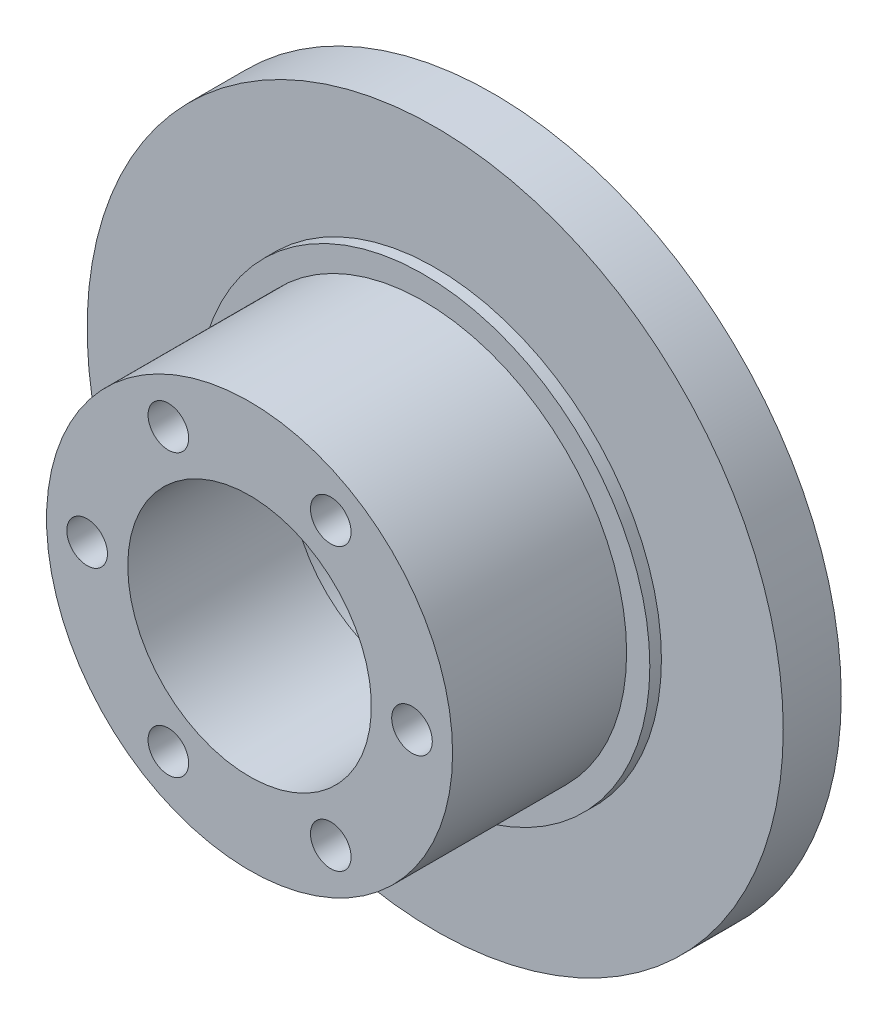
ISO-10303-21;
HEADER;
FILE_DESCRIPTION(('STEP AP214'),'2;1');
FILE_NAME('part.step','',(''),(''),'','','');
FILE_SCHEMA(('AUTOMOTIVE_DESIGN { 1 0 10303 214 1 1 1 1 }'));
ENDSEC;
DATA;
#1=APPLICATION_CONTEXT('core data for automotive mechanical design processes');
#2=APPLICATION_PROTOCOL_DEFINITION('international standard','automotive_design',2000,#1);
#3=PRODUCT_CONTEXT('',#1,'mechanical');
#4=PRODUCT('Part','Part','',(#3));
#5=PRODUCT_RELATED_PRODUCT_CATEGORY('part','',(#4));
#6=PRODUCT_DEFINITION_FORMATION('','',#4);
#7=PRODUCT_DEFINITION_CONTEXT('part definition',#1,'design');
#8=PRODUCT_DEFINITION('design','',#6,#7);
#9=PRODUCT_DEFINITION_SHAPE('','',#8);
#10=(LENGTH_UNIT() NAMED_UNIT(*) SI_UNIT(.MILLI.,.METRE.));
#11=(NAMED_UNIT(*) PLANE_ANGLE_UNIT() SI_UNIT($,.RADIAN.));
#12=(NAMED_UNIT(*) SI_UNIT($,.STERADIAN.) SOLID_ANGLE_UNIT());
#13=UNCERTAINTY_MEASURE_WITH_UNIT(LENGTH_MEASURE(1.E-05),#10,'distance_accuracy_value','');
#14=(GEOMETRIC_REPRESENTATION_CONTEXT(3) GLOBAL_UNCERTAINTY_ASSIGNED_CONTEXT((#13)) GLOBAL_UNIT_ASSIGNED_CONTEXT((#10,
#11,#12)) REPRESENTATION_CONTEXT('',''));
#15=CARTESIAN_POINT('',(0.,0.,0.));
#16=DIRECTION('',(0.,0.,1.));
#17=DIRECTION('',(1.,0.,0.));
#18=AXIS2_PLACEMENT_3D('',#15,#16,#17);
#19=CARTESIAN_POINT('',(0.,0.,5.));
#20=DIRECTION('',(0.,0.,-1.));
#21=DIRECTION('',(-1.,0.,0.));
#22=AXIS2_PLACEMENT_3D('',#19,#20,#21);
#23=CYLINDRICAL_SURFACE('',#22,30.);
#24=CARTESIAN_POINT('',(0.,0.,5.));
#25=DIRECTION('',(0.,0.,1.));
#26=DIRECTION('',(1.,0.,0.));
#27=AXIS2_PLACEMENT_3D('',#24,#25,#26);
#28=CIRCLE('',#27,30.);
#29=CARTESIAN_POINT('',(30.,0.,5.));
#30=VERTEX_POINT('',#29);
#31=EDGE_CURVE('E51',#30,#30,#28,.T.);
#32=ORIENTED_EDGE('',*,*,#31,.F.);
#33=EDGE_LOOP('',(#32));
#34=FACE_BOUND('',#33,.T.);
#35=CARTESIAN_POINT('',(0.,0.,0.));
#36=DIRECTION('',(0.,0.,1.));
#37=DIRECTION('',(1.,0.,0.));
#38=AXIS2_PLACEMENT_3D('',#35,#36,#37);
#39=CIRCLE('',#38,30.);
#40=CARTESIAN_POINT('',(30.,0.,0.));
#41=VERTEX_POINT('',#40);
#42=EDGE_CURVE('E60',#41,#41,#39,.T.);
#43=ORIENTED_EDGE('',*,*,#42,.T.);
#44=EDGE_LOOP('',(#43));
#45=FACE_BOUND('',#44,.T.);
#46=ADVANCED_FACE('F37',(#34,#45),#23,.T.);
#47=CARTESIAN_POINT('',(0.,0.,5.));
#48=DIRECTION('',(0.,0.,1.));
#49=DIRECTION('',(1.,0.,0.));
#50=AXIS2_PLACEMENT_3D('',#47,#48,#49);
#51=PLANE('',#50);
#52=CARTESIAN_POINT('',(0.,0.,5.));
#53=DIRECTION('',(0.,0.,1.));
#54=DIRECTION('',(1.,0.,0.));
#55=AXIS2_PLACEMENT_3D('',#52,#53,#54);
#56=CIRCLE('',#55,19.5);
#57=CARTESIAN_POINT('',(19.5,0.,5.));
#58=VERTEX_POINT('',#57);
#59=EDGE_CURVE('E45',#58,#58,#56,.T.);
#60=ORIENTED_EDGE('',*,*,#59,.F.);
#61=EDGE_LOOP('',(#60));
#62=FACE_BOUND('',#61,.T.);
#63=ORIENTED_EDGE('',*,*,#31,.T.);
#64=EDGE_LOOP('',(#63));
#65=FACE_BOUND('',#64,.T.);
#66=ADVANCED_FACE('F119',(#62,#65),#51,.T.);
#67=CARTESIAN_POINT('',(0.,0.,0.));
#68=DIRECTION('',(0.,0.,1.));
#69=DIRECTION('',(1.,0.,0.));
#70=AXIS2_PLACEMENT_3D('',#67,#68,#69);
#71=PLANE('',#70);
#72=CARTESIAN_POINT('',(24.5,0.,0.));
#73=DIRECTION('',(0.,0.,1.));
#74=DIRECTION('',(1.,0.,0.));
#75=AXIS2_PLACEMENT_3D('',#72,#73,#74);
#76=CIRCLE('',#75,2.);
#77=CARTESIAN_POINT('',(26.5,0.,0.));
#78=VERTEX_POINT('',#77);
#79=EDGE_CURVE('E40',#78,#78,#76,.F.);
#80=ORIENTED_EDGE('',*,*,#79,.F.);
#81=EDGE_LOOP('',(#80));
#82=FACE_BOUND('',#81,.T.);
#83=CARTESIAN_POINT('',(12.2500000000002,21.2176223927186,0.));
#84=DIRECTION('',(0.,0.,1.));
#85=DIRECTION('',(1.,0.,0.));
#86=AXIS2_PLACEMENT_3D('',#83,#84,#85);
#87=CIRCLE('',#86,2.);
#88=CARTESIAN_POINT('',(14.2500000000002,21.2176223927186,0.));
#89=VERTEX_POINT('',#88);
#90=EDGE_CURVE('E84',#89,#89,#87,.F.);
#91=ORIENTED_EDGE('',*,*,#90,.F.);
#92=EDGE_LOOP('',(#91));
#93=FACE_BOUND('',#92,.T.);
#94=CARTESIAN_POINT('',(-12.2499999999998,21.2176223927189,0.));
#95=DIRECTION('',(0.,0.,1.));
#96=DIRECTION('',(1.,0.,0.));
#97=AXIS2_PLACEMENT_3D('',#94,#95,#96);
#98=CIRCLE('',#97,2.);
#99=CARTESIAN_POINT('',(-10.2499999999998,21.2176223927189,0.));
#100=VERTEX_POINT('',#99);
#101=EDGE_CURVE('E81',#100,#100,#98,.F.);
#102=ORIENTED_EDGE('',*,*,#101,.F.);
#103=EDGE_LOOP('',(#102));
#104=FACE_BOUND('',#103,.T.);
#105=CARTESIAN_POINT('',(-24.5,1.71082585603314E-13,0.));
#106=DIRECTION('',(0.,0.,1.));
#107=DIRECTION('',(1.,0.,0.));
#108=AXIS2_PLACEMENT_3D('',#105,#106,#107);
#109=CIRCLE('',#108,2.);
#110=CARTESIAN_POINT('',(-22.5,1.71082585603314E-13,0.));
#111=VERTEX_POINT('',#110);
#112=EDGE_CURVE('E77',#111,#111,#109,.F.);
#113=ORIENTED_EDGE('',*,*,#112,.F.);
#114=EDGE_LOOP('',(#113));
#115=FACE_BOUND('',#114,.T.);
#116=CARTESIAN_POINT('',(-12.2500000000001,-21.2176223927187,0.));
#117=DIRECTION('',(0.,0.,1.));
#118=DIRECTION('',(1.,0.,0.));
#119=AXIS2_PLACEMENT_3D('',#116,#117,#118);
#120=CIRCLE('',#119,2.);
#121=CARTESIAN_POINT('',(-10.2500000000001,-21.2176223927187,0.));
#122=VERTEX_POINT('',#121);
#123=EDGE_CURVE('E72',#122,#122,#120,.F.);
#124=ORIENTED_EDGE('',*,*,#123,.F.);
#125=EDGE_LOOP('',(#124));
#126=FACE_BOUND('',#125,.T.);
#127=CARTESIAN_POINT('',(12.25,-21.2176223927188,0.));
#128=DIRECTION('',(0.,0.,1.));
#129=DIRECTION('',(1.,0.,0.));
#130=AXIS2_PLACEMENT_3D('',#127,#128,#129);
#131=CIRCLE('',#130,2.);
#132=CARTESIAN_POINT('',(14.25,-21.2176223927188,0.));
#133=VERTEX_POINT('',#132);
#134=EDGE_CURVE('E68',#133,#133,#131,.F.);
#135=ORIENTED_EDGE('',*,*,#134,.F.);
#136=EDGE_LOOP('',(#135));
#137=FACE_BOUND('',#136,.T.);
#138=CARTESIAN_POINT('',(0.,0.,0.));
#139=DIRECTION('',(0.,0.,-1.));
#140=DIRECTION('',(-1.,0.,0.));
#141=AXIS2_PLACEMENT_3D('',#138,#139,#140);
#142=CIRCLE('',#141,12.025);
#143=CARTESIAN_POINT('',(-12.025,0.,0.));
#144=VERTEX_POINT('',#143);
#145=EDGE_CURVE('E102',#144,#144,#142,.T.);
#146=ORIENTED_EDGE('',*,*,#145,.F.);
#147=EDGE_LOOP('',(#146));
#148=FACE_BOUND('',#147,.T.);
#149=ORIENTED_EDGE('',*,*,#42,.F.);
#150=EDGE_LOOP('',(#149));
#151=FACE_BOUND('',#150,.T.);
#152=ADVANCED_FACE('F115',(#82,#93,#104,#115,#126,#137,#148,#151),#71,.F.);
#153=CARTESIAN_POINT('',(0.,0.,6.));
#154=DIRECTION('',(0.,0.,-1.));
#155=DIRECTION('',(-1.,0.,0.));
#156=AXIS2_PLACEMENT_3D('',#153,#154,#155);
#157=CYLINDRICAL_SURFACE('',#156,19.5);
#158=CARTESIAN_POINT('',(0.,0.,6.));
#159=DIRECTION('',(0.,0.,1.));
#160=DIRECTION('',(1.,0.,0.));
#161=AXIS2_PLACEMENT_3D('',#158,#159,#160);
#162=CIRCLE('',#161,19.5);
#163=CARTESIAN_POINT('',(19.5,0.,6.));
#164=VERTEX_POINT('',#163);
#165=EDGE_CURVE('E57',#164,#164,#162,.T.);
#166=ORIENTED_EDGE('',*,*,#165,.F.);
#167=EDGE_LOOP('',(#166));
#168=FACE_BOUND('',#167,.T.);
#169=ORIENTED_EDGE('',*,*,#59,.T.);
#170=EDGE_LOOP('',(#169));
#171=FACE_BOUND('',#170,.T.);
#172=ADVANCED_FACE('F118',(#168,#171),#157,.T.);
#173=CARTESIAN_POINT('',(0.,0.,6.));
#174=DIRECTION('',(0.,0.,1.));
#175=DIRECTION('',(1.,0.,0.));
#176=AXIS2_PLACEMENT_3D('',#173,#174,#175);
#177=PLANE('',#176);
#178=CARTESIAN_POINT('',(0.,0.,6.));
#179=DIRECTION('',(0.,0.,1.));
#180=DIRECTION('',(1.,0.,0.));
#181=AXIS2_PLACEMENT_3D('',#178,#179,#180);
#182=CIRCLE('',#181,17.5);
#183=CARTESIAN_POINT('',(17.5,0.,6.));
#184=VERTEX_POINT('',#183);
#185=EDGE_CURVE('E10',#184,#184,#182,.T.);
#186=ORIENTED_EDGE('',*,*,#185,.F.);
#187=EDGE_LOOP('',(#186));
#188=FACE_BOUND('',#187,.T.);
#189=ORIENTED_EDGE('',*,*,#165,.T.);
#190=EDGE_LOOP('',(#189));
#191=FACE_BOUND('',#190,.T.);
#192=ADVANCED_FACE('F138',(#188,#191),#177,.T.);
#193=CARTESIAN_POINT('',(0.,0.,21.));
#194=DIRECTION('',(0.,0.,-1.));
#195=DIRECTION('',(-1.,0.,0.));
#196=AXIS2_PLACEMENT_3D('',#193,#194,#195);
#197=CYLINDRICAL_SURFACE('',#196,17.5);
#198=CARTESIAN_POINT('',(0.,0.,21.));
#199=DIRECTION('',(0.,0.,1.));
#200=DIRECTION('',(1.,0.,0.));
#201=AXIS2_PLACEMENT_3D('',#198,#199,#200);
#202=CIRCLE('',#201,17.5);
#203=CARTESIAN_POINT('',(17.5,0.,21.));
#204=VERTEX_POINT('',#203);
#205=EDGE_CURVE('E55',#204,#204,#202,.T.);
#206=ORIENTED_EDGE('',*,*,#205,.F.);
#207=EDGE_LOOP('',(#206));
#208=FACE_BOUND('',#207,.T.);
#209=ORIENTED_EDGE('',*,*,#185,.T.);
#210=EDGE_LOOP('',(#209));
#211=FACE_BOUND('',#210,.T.);
#212=ADVANCED_FACE('F142',(#208,#211),#197,.T.);
#213=CARTESIAN_POINT('',(0.,0.,21.));
#214=DIRECTION('',(0.,0.,1.));
#215=DIRECTION('',(1.,0.,0.));
#216=AXIS2_PLACEMENT_3D('',#213,#214,#215);
#217=PLANE('',#216);
#218=CARTESIAN_POINT('',(14.,0.,21.));
#219=DIRECTION('',(0.,0.,1.));
#220=DIRECTION('',(1.,0.,0.));
#221=AXIS2_PLACEMENT_3D('',#218,#219,#220);
#222=CIRCLE('',#221,1.75);
#223=CARTESIAN_POINT('',(15.75,0.,21.));
#224=VERTEX_POINT('',#223);
#225=EDGE_CURVE('E264',#224,#224,#222,.T.);
#226=ORIENTED_EDGE('',*,*,#225,.F.);
#227=EDGE_LOOP('',(#226));
#228=FACE_BOUND('',#227,.T.);
#229=CARTESIAN_POINT('',(7.00000000000014,12.1243556529821,21.));
#230=DIRECTION('',(0.,0.,1.));
#231=DIRECTION('',(1.,0.,0.));
#232=AXIS2_PLACEMENT_3D('',#229,#230,#231);
#233=CIRCLE('',#232,1.75);
#234=CARTESIAN_POINT('',(8.75000000000014,12.1243556529821,21.));
#235=VERTEX_POINT('',#234);
#236=EDGE_CURVE('E280',#235,#235,#233,.T.);
#237=ORIENTED_EDGE('',*,*,#236,.F.);
#238=EDGE_LOOP('',(#237));
#239=FACE_BOUND('',#238,.T.);
#240=CARTESIAN_POINT('',(-6.99999999999989,12.1243556529822,21.));
#241=DIRECTION('',(0.,0.,1.));
#242=DIRECTION('',(1.,0.,0.));
#243=AXIS2_PLACEMENT_3D('',#240,#241,#242);
#244=CIRCLE('',#243,1.75);
#245=CARTESIAN_POINT('',(-5.24999999999989,12.1243556529822,21.));
#246=VERTEX_POINT('',#245);
#247=EDGE_CURVE('E279',#246,#246,#244,.T.);
#248=ORIENTED_EDGE('',*,*,#247,.F.);
#249=EDGE_LOOP('',(#248));
#250=FACE_BOUND('',#249,.T.);
#251=CARTESIAN_POINT('',(-14.,0.,21.));
#252=DIRECTION('',(0.,0.,1.));
#253=DIRECTION('',(1.,0.,0.));
#254=AXIS2_PLACEMENT_3D('',#251,#252,#253);
#255=CIRCLE('',#254,1.75);
#256=CARTESIAN_POINT('',(-12.25,0.,21.));
#257=VERTEX_POINT('',#256);
#258=EDGE_CURVE('E303',#257,#257,#255,.T.);
#259=ORIENTED_EDGE('',*,*,#258,.F.);
#260=EDGE_LOOP('',(#259));
#261=FACE_BOUND('',#260,.T.);
#262=CARTESIAN_POINT('',(-7.00000000000006,-12.1243556529821,21.));
#263=DIRECTION('',(0.,0.,1.));
#264=DIRECTION('',(1.,0.,0.));
#265=AXIS2_PLACEMENT_3D('',#262,#263,#264);
#266=CIRCLE('',#265,1.75);
#267=CARTESIAN_POINT('',(-5.25000000000006,-12.1243556529821,21.));
#268=VERTEX_POINT('',#267);
#269=EDGE_CURVE('E295',#268,#268,#266,.T.);
#270=ORIENTED_EDGE('',*,*,#269,.F.);
#271=EDGE_LOOP('',(#270));
#272=FACE_BOUND('',#271,.T.);
#273=CARTESIAN_POINT('',(6.99999999999997,-12.1243556529822,21.));
#274=DIRECTION('',(0.,0.,1.));
#275=DIRECTION('',(1.,0.,0.));
#276=AXIS2_PLACEMENT_3D('',#273,#274,#275);
#277=CIRCLE('',#276,1.75);
#278=CARTESIAN_POINT('',(8.74999999999997,-12.1243556529822,21.));
#279=VERTEX_POINT('',#278);
#280=EDGE_CURVE('E287',#279,#279,#277,.T.);
#281=ORIENTED_EDGE('',*,*,#280,.F.);
#282=EDGE_LOOP('',(#281));
#283=FACE_BOUND('',#282,.T.);
#284=CARTESIAN_POINT('',(0.,0.,21.));
#285=DIRECTION('',(0.,0.,-1.));
#286=DIRECTION('',(-1.,0.,0.));
#287=AXIS2_PLACEMENT_3D('',#284,#285,#286);
#288=CIRCLE('',#287,10.5);
#289=CARTESIAN_POINT('',(-10.5,0.,21.));
#290=VERTEX_POINT('',#289);
#291=EDGE_CURVE('E96',#290,#290,#288,.T.);
#292=ORIENTED_EDGE('',*,*,#291,.T.);
#293=EDGE_LOOP('',(#292));
#294=FACE_BOUND('',#293,.T.);
#295=ORIENTED_EDGE('',*,*,#205,.T.);
#296=EDGE_LOOP('',(#295));
#297=FACE_BOUND('',#296,.T.);
#298=ADVANCED_FACE('F146',(#228,#239,#250,#261,#272,#283,#294,#297),#217,.T.);
#299=CARTESIAN_POINT('',(0.,0.,7.));
#300=DIRECTION('',(0.,0.,-1.));
#301=DIRECTION('',(-1.,0.,0.));
#302=AXIS2_PLACEMENT_3D('',#299,#300,#301);
#303=CYLINDRICAL_SURFACE('',#302,12.025);
#304=CARTESIAN_POINT('',(0.,0.,7.));
#305=DIRECTION('',(0.,0.,-1.));
#306=DIRECTION('',(-1.,0.,0.));
#307=AXIS2_PLACEMENT_3D('',#304,#305,#306);
#308=CIRCLE('',#307,12.025);
#309=CARTESIAN_POINT('',(-12.025,0.,7.));
#310=VERTEX_POINT('',#309);
#311=EDGE_CURVE('E106',#310,#310,#308,.T.);
#312=ORIENTED_EDGE('',*,*,#311,.F.);
#313=EDGE_LOOP('',(#312));
#314=FACE_BOUND('',#313,.T.);
#315=ORIENTED_EDGE('',*,*,#145,.T.);
#316=EDGE_LOOP('',(#315));
#317=FACE_BOUND('',#316,.T.);
#318=ADVANCED_FACE('F113',(#314,#317),#303,.F.);
#319=CARTESIAN_POINT('',(0.,0.,7.));
#320=DIRECTION('',(0.,0.,-1.));
#321=DIRECTION('',(-1.,0.,0.));
#322=AXIS2_PLACEMENT_3D('',#319,#320,#321);
#323=PLANE('',#322);
#324=CARTESIAN_POINT('',(0.,0.,7.));
#325=DIRECTION('',(0.,0.,-1.));
#326=DIRECTION('',(-1.,0.,0.));
#327=AXIS2_PLACEMENT_3D('',#324,#325,#326);
#328=CIRCLE('',#327,10.5);
#329=CARTESIAN_POINT('',(-10.5,0.,7.));
#330=VERTEX_POINT('',#329);
#331=EDGE_CURVE('E91',#330,#330,#328,.T.);
#332=ORIENTED_EDGE('',*,*,#331,.F.);
#333=EDGE_LOOP('',(#332));
#334=FACE_BOUND('',#333,.T.);
#335=ORIENTED_EDGE('',*,*,#311,.T.);
#336=EDGE_LOOP('',(#335));
#337=FACE_BOUND('',#336,.T.);
#338=ADVANCED_FACE('F153',(#334,#337),#323,.T.);
#339=CARTESIAN_POINT('',(0.,0.,21.));
#340=DIRECTION('',(0.,0.,-1.));
#341=DIRECTION('',(-1.,0.,0.));
#342=AXIS2_PLACEMENT_3D('',#339,#340,#341);
#343=CYLINDRICAL_SURFACE('',#342,10.5);
#344=CARTESIAN_POINT('',(-10.5,0.,21.));
#345=CARTESIAN_POINT('',(-10.5,0.,20.8541666666667));
#346=CARTESIAN_POINT('',(-10.5,0.,20.7083333333333));
#347=CARTESIAN_POINT('',(-10.5,0.,20.4166666666667));
#348=CARTESIAN_POINT('',(-10.5,0.,20.2708333333333));
#349=CARTESIAN_POINT('',(-10.5,0.,19.9791666666667));
#350=CARTESIAN_POINT('',(-10.5,0.,19.8333333333333));
#351=CARTESIAN_POINT('',(-10.5,0.,19.5416666666667));
#352=CARTESIAN_POINT('',(-10.5,0.,19.3958333333333));
#353=CARTESIAN_POINT('',(-10.5,0.,19.1041666666667));
#354=CARTESIAN_POINT('',(-10.5,0.,18.9583333333333));
#355=CARTESIAN_POINT('',(-10.5,0.,18.6666666666667));
#356=CARTESIAN_POINT('',(-10.5,0.,18.5208333333333));
#357=CARTESIAN_POINT('',(-10.5,0.,18.2291666666667));
#358=CARTESIAN_POINT('',(-10.5,0.,18.0833333333333));
#359=CARTESIAN_POINT('',(-10.5,0.,17.7916666666667));
#360=CARTESIAN_POINT('',(-10.5,0.,17.6458333333333));
#361=CARTESIAN_POINT('',(-10.5,0.,17.3541666666667));
#362=CARTESIAN_POINT('',(-10.5,0.,17.2083333333333));
#363=CARTESIAN_POINT('',(-10.5,0.,16.9166666666667));
#364=CARTESIAN_POINT('',(-10.5,0.,16.7708333333333));
#365=CARTESIAN_POINT('',(-10.5,0.,16.4791666666667));
#366=CARTESIAN_POINT('',(-10.5,0.,16.3333333333333));
#367=CARTESIAN_POINT('',(-10.5,0.,16.0416666666667));
#368=CARTESIAN_POINT('',(-10.5,0.,15.8958333333333));
#369=CARTESIAN_POINT('',(-10.5,0.,15.6041666666667));
#370=CARTESIAN_POINT('',(-10.5,0.,15.4583333333333));
#371=CARTESIAN_POINT('',(-10.5,0.,15.1666666666667));
#372=CARTESIAN_POINT('',(-10.5,0.,15.0208333333333));
#373=CARTESIAN_POINT('',(-10.5,0.,14.7291666666667));
#374=CARTESIAN_POINT('',(-10.5,0.,14.5833333333333));
#375=CARTESIAN_POINT('',(-10.5,0.,14.2916666666667));
#376=CARTESIAN_POINT('',(-10.5,0.,14.1458333333333));
#377=CARTESIAN_POINT('',(-10.5,0.,13.8541666666667));
#378=CARTESIAN_POINT('',(-10.5,0.,13.7083333333333));
#379=CARTESIAN_POINT('',(-10.5,0.,13.4166666666667));
#380=CARTESIAN_POINT('',(-10.5,0.,13.2708333333333));
#381=CARTESIAN_POINT('',(-10.5,0.,12.9791666666667));
#382=CARTESIAN_POINT('',(-10.5,0.,12.8333333333333));
#383=CARTESIAN_POINT('',(-10.5,0.,12.5416666666667));
#384=CARTESIAN_POINT('',(-10.5,0.,12.3958333333333));
#385=CARTESIAN_POINT('',(-10.5,0.,12.1041666666667));
#386=CARTESIAN_POINT('',(-10.5,0.,11.9583333333333));
#387=CARTESIAN_POINT('',(-10.5,0.,11.6666666666667));
#388=CARTESIAN_POINT('',(-10.5,0.,11.5208333333333));
#389=CARTESIAN_POINT('',(-10.5,0.,11.2291666666667));
#390=CARTESIAN_POINT('',(-10.5,0.,11.0833333333333));
#391=CARTESIAN_POINT('',(-10.5,0.,10.7916666666667));
#392=CARTESIAN_POINT('',(-10.5,0.,10.6458333333333));
#393=CARTESIAN_POINT('',(-10.5,0.,10.3541666666667));
#394=CARTESIAN_POINT('',(-10.5,0.,10.2083333333333));
#395=CARTESIAN_POINT('',(-10.5,0.,9.91666666666667));
#396=CARTESIAN_POINT('',(-10.5,0.,9.77083333333333));
#397=CARTESIAN_POINT('',(-10.5,0.,9.47916666666667));
#398=CARTESIAN_POINT('',(-10.5,0.,9.33333333333333));
#399=CARTESIAN_POINT('',(-10.5,0.,9.04166666666667));
#400=CARTESIAN_POINT('',(-10.5,0.,8.89583333333333));
#401=CARTESIAN_POINT('',(-10.5,0.,8.60416666666667));
#402=CARTESIAN_POINT('',(-10.5,0.,8.45833333333333));
#403=CARTESIAN_POINT('',(-10.5,0.,8.16666666666667));
#404=CARTESIAN_POINT('',(-10.5,0.,8.02083333333333));
#405=CARTESIAN_POINT('',(-10.5,0.,7.72916666666667));
#406=CARTESIAN_POINT('',(-10.5,0.,7.58333333333333));
#407=CARTESIAN_POINT('',(-10.5,0.,7.29166666666667));
#408=CARTESIAN_POINT('',(-10.5,0.,7.14583333333333));
#409=CARTESIAN_POINT('',(-10.5,0.,7.));
#410=B_SPLINE_CURVE_WITH_KNOTS('',3,(#344,#345,#346,#347,#348,#349,#350,#351,#352,#353,#354,
#355,#356,#357,#358,#359,#360,#361,#362,#363,#364,#365,#366,#367,#368,#369,#370,#371,#372,#373,
#374,#375,#376,#377,#378,#379,#380,#381,#382,#383,#384,#385,#386,#387,#388,#389,#390,#391,#392,
#393,#394,#395,#396,#397,#398,#399,#400,#401,#402,#403,#404,#405,#406,#407,#408,#409),
.UNSPECIFIED.,.F.,.F.,(4,2,2,2,2,2,2,2,2,2,2,2,2,2,2,2,2,2,2,2,2,2,2,2,2,2,2,2,2,2,2,2,4),(0.,
0.4375,0.875000000000001,1.3125,1.75,2.1875,2.625,3.0625,3.5,3.9375,4.375,4.8125,5.25,5.6875,
6.125,6.5625,7.,7.4375,7.875,8.3125,8.75,9.1875,9.625,10.0625,10.5,10.9375,11.375,11.8125,12.25,
12.6875,13.125,13.5625,14.),.UNSPECIFIED.);
#411=EDGE_CURVE('BSEAM157',#290,#330,#410,.T.);
#412=ORIENTED_EDGE('',*,*,#291,.F.);
#413=ORIENTED_EDGE('',*,*,#331,.T.);
#414=ORIENTED_EDGE('',*,*,#411,.T.);
#415=ORIENTED_EDGE('',*,*,#411,.F.);
#416=EDGE_LOOP('',(#412,#414,#413,#415));
#417=FACE_BOUND('',#416,.T.);
#418=ADVANCED_FACE('F157',(#417),#343,.F.);
#419=CARTESIAN_POINT('',(12.25,-21.2176223927188,4.));
#420=DIRECTION('',(0.,0.,-1.));
#421=DIRECTION('',(-1.,0.,0.));
#422=AXIS2_PLACEMENT_3D('',#419,#420,#421);
#423=CYLINDRICAL_SURFACE('',#422,2.);
#424=CARTESIAN_POINT('',(12.25,-21.2176223927188,4.));
#425=DIRECTION('',(0.,0.,1.));
#426=DIRECTION('',(1.,0.,0.));
#427=AXIS2_PLACEMENT_3D('',#424,#425,#426);
#428=CIRCLE('',#427,2.);
#429=CARTESIAN_POINT('',(14.25,-21.2176223927188,4.));
#430=VERTEX_POINT('',#429);
#431=EDGE_CURVE('E316',#430,#430,#428,.T.);
#432=ORIENTED_EDGE('',*,*,#431,.T.);
#433=EDGE_LOOP('',(#432));
#434=FACE_BOUND('',#433,.T.);
#435=ORIENTED_EDGE('',*,*,#134,.T.);
#436=EDGE_LOOP('',(#435));
#437=FACE_BOUND('',#436,.T.);
#438=ADVANCED_FACE('F161',(#434,#437),#423,.F.);
#439=CARTESIAN_POINT('',(12.25,-21.2176223927188,4.));
#440=DIRECTION('',(0.,0.,1.));
#441=DIRECTION('',(1.,0.,0.));
#442=AXIS2_PLACEMENT_3D('',#439,#440,#441);
#443=PLANE('',#442);
#444=ORIENTED_EDGE('',*,*,#431,.F.);
#445=EDGE_LOOP('',(#444));
#446=FACE_BOUND('',#445,.T.);
#447=ADVANCED_FACE('F184',(#446),#443,.F.);
#448=CARTESIAN_POINT('',(-12.2500000000001,-21.2176223927187,4.));
#449=DIRECTION('',(0.,0.,-1.));
#450=DIRECTION('',(-1.,0.,0.));
#451=AXIS2_PLACEMENT_3D('',#448,#449,#450);
#452=CYLINDRICAL_SURFACE('',#451,2.);
#453=CARTESIAN_POINT('',(-12.2500000000001,-21.2176223927187,4.));
#454=DIRECTION('',(0.,0.,1.));
#455=DIRECTION('',(1.,0.,0.));
#456=AXIS2_PLACEMENT_3D('',#453,#454,#455);
#457=CIRCLE('',#456,2.);
#458=CARTESIAN_POINT('',(-10.2500000000001,-21.2176223927187,4.));
#459=VERTEX_POINT('',#458);
#460=EDGE_CURVE('E321',#459,#459,#457,.T.);
#461=ORIENTED_EDGE('',*,*,#460,.T.);
#462=EDGE_LOOP('',(#461));
#463=FACE_BOUND('',#462,.T.);
#464=ORIENTED_EDGE('',*,*,#123,.T.);
#465=EDGE_LOOP('',(#464));
#466=FACE_BOUND('',#465,.T.);
#467=ADVANCED_FACE('F181',(#463,#466),#452,.F.);
#468=CARTESIAN_POINT('',(-12.2500000000001,-21.2176223927187,4.));
#469=DIRECTION('',(0.,0.,1.));
#470=DIRECTION('',(1.,0.,0.));
#471=AXIS2_PLACEMENT_3D('',#468,#469,#470);
#472=PLANE('',#471);
#473=ORIENTED_EDGE('',*,*,#460,.F.);
#474=EDGE_LOOP('',(#473));
#475=FACE_BOUND('',#474,.T.);
#476=ADVANCED_FACE('F176',(#475),#472,.F.);
#477=CARTESIAN_POINT('',(-24.5,1.71082585603314E-13,4.));
#478=DIRECTION('',(0.,0.,-1.));
#479=DIRECTION('',(-1.,0.,0.));
#480=AXIS2_PLACEMENT_3D('',#477,#478,#479);
#481=CYLINDRICAL_SURFACE('',#480,2.);
#482=CARTESIAN_POINT('',(-24.5,1.71082585603314E-13,4.));
#483=DIRECTION('',(0.,0.,1.));
#484=DIRECTION('',(1.,0.,0.));
#485=AXIS2_PLACEMENT_3D('',#482,#483,#484);
#486=CIRCLE('',#485,2.);
#487=CARTESIAN_POINT('',(-22.5,1.71082585603314E-13,4.));
#488=VERTEX_POINT('',#487);
#489=EDGE_CURVE('E325',#488,#488,#486,.T.);
#490=ORIENTED_EDGE('',*,*,#489,.T.);
#491=EDGE_LOOP('',(#490));
#492=FACE_BOUND('',#491,.T.);
#493=ORIENTED_EDGE('',*,*,#112,.T.);
#494=EDGE_LOOP('',(#493));
#495=FACE_BOUND('',#494,.T.);
#496=ADVANCED_FACE('F173',(#492,#495),#481,.F.);
#497=CARTESIAN_POINT('',(-24.5,1.71082585603314E-13,4.));
#498=DIRECTION('',(0.,0.,1.));
#499=DIRECTION('',(1.,0.,0.));
#500=AXIS2_PLACEMENT_3D('',#497,#498,#499);
#501=PLANE('',#500);
#502=ORIENTED_EDGE('',*,*,#489,.F.);
#503=EDGE_LOOP('',(#502));
#504=FACE_BOUND('',#503,.T.);
#505=ADVANCED_FACE('F167',(#504),#501,.F.);
#506=CARTESIAN_POINT('',(-12.2499999999998,21.2176223927189,4.));
#507=DIRECTION('',(0.,0.,-1.));
#508=DIRECTION('',(-1.,0.,0.));
#509=AXIS2_PLACEMENT_3D('',#506,#507,#508);
#510=CYLINDRICAL_SURFACE('',#509,2.);
#511=CARTESIAN_POINT('',(-12.2499999999998,21.2176223927189,4.));
#512=DIRECTION('',(0.,0.,1.));
#513=DIRECTION('',(1.,0.,0.));
#514=AXIS2_PLACEMENT_3D('',#511,#512,#513);
#515=CIRCLE('',#514,2.);
#516=CARTESIAN_POINT('',(-10.2499999999998,21.2176223927189,4.));
#517=VERTEX_POINT('',#516);
#518=EDGE_CURVE('E269',#517,#517,#515,.T.);
#519=ORIENTED_EDGE('',*,*,#518,.T.);
#520=EDGE_LOOP('',(#519));
#521=FACE_BOUND('',#520,.T.);
#522=ORIENTED_EDGE('',*,*,#101,.T.);
#523=EDGE_LOOP('',(#522));
#524=FACE_BOUND('',#523,.T.);
#525=ADVANCED_FACE('F163',(#521,#524),#510,.F.);
#526=CARTESIAN_POINT('',(-12.2499999999998,21.2176223927189,4.));
#527=DIRECTION('',(0.,0.,1.));
#528=DIRECTION('',(1.,0.,0.));
#529=AXIS2_PLACEMENT_3D('',#526,#527,#528);
#530=PLANE('',#529);
#531=ORIENTED_EDGE('',*,*,#518,.F.);
#532=EDGE_LOOP('',(#531));
#533=FACE_BOUND('',#532,.T.);
#534=ADVANCED_FACE('F166',(#533),#530,.F.);
#535=CARTESIAN_POINT('',(12.2500000000002,21.2176223927186,4.));
#536=DIRECTION('',(0.,0.,-1.));
#537=DIRECTION('',(-1.,0.,0.));
#538=AXIS2_PLACEMENT_3D('',#535,#536,#537);
#539=CYLINDRICAL_SURFACE('',#538,2.);
#540=CARTESIAN_POINT('',(12.2500000000002,21.2176223927186,4.));
#541=DIRECTION('',(0.,0.,1.));
#542=DIRECTION('',(1.,0.,0.));
#543=AXIS2_PLACEMENT_3D('',#540,#541,#542);
#544=CIRCLE('',#543,2.);
#545=CARTESIAN_POINT('',(14.2500000000002,21.2176223927186,4.));
#546=VERTEX_POINT('',#545);
#547=EDGE_CURVE('E263',#546,#546,#544,.T.);
#548=ORIENTED_EDGE('',*,*,#547,.T.);
#549=EDGE_LOOP('',(#548));
#550=FACE_BOUND('',#549,.T.);
#551=ORIENTED_EDGE('',*,*,#90,.T.);
#552=EDGE_LOOP('',(#551));
#553=FACE_BOUND('',#552,.T.);
#554=ADVANCED_FACE('F171',(#550,#553),#539,.F.);
#555=CARTESIAN_POINT('',(12.2500000000002,21.2176223927186,4.));
#556=DIRECTION('',(0.,0.,1.));
#557=DIRECTION('',(1.,0.,0.));
#558=AXIS2_PLACEMENT_3D('',#555,#556,#557);
#559=PLANE('',#558);
#560=ORIENTED_EDGE('',*,*,#547,.F.);
#561=EDGE_LOOP('',(#560));
#562=FACE_BOUND('',#561,.T.);
#563=ADVANCED_FACE('F197',(#562),#559,.F.);
#564=CARTESIAN_POINT('',(24.5,0.,4.));
#565=DIRECTION('',(0.,0.,-1.));
#566=DIRECTION('',(-1.,0.,0.));
#567=AXIS2_PLACEMENT_3D('',#564,#565,#566);
#568=CYLINDRICAL_SURFACE('',#567,2.);
#569=CARTESIAN_POINT('',(24.5,0.,4.));
#570=DIRECTION('',(0.,0.,1.));
#571=DIRECTION('',(1.,0.,0.));
#572=AXIS2_PLACEMENT_3D('',#569,#570,#571);
#573=CIRCLE('',#572,2.);
#574=CARTESIAN_POINT('',(26.5,0.,4.));
#575=VERTEX_POINT('',#574);
#576=EDGE_CURVE('E73',#575,#575,#573,.T.);
#577=ORIENTED_EDGE('',*,*,#576,.T.);
#578=EDGE_LOOP('',(#577));
#579=FACE_BOUND('',#578,.T.);
#580=ORIENTED_EDGE('',*,*,#79,.T.);
#581=EDGE_LOOP('',(#580));
#582=FACE_BOUND('',#581,.T.);
#583=ADVANCED_FACE('F201',(#579,#582),#568,.F.);
#584=CARTESIAN_POINT('',(24.5,0.,4.));
#585=DIRECTION('',(0.,0.,1.));
#586=DIRECTION('',(1.,0.,0.));
#587=AXIS2_PLACEMENT_3D('',#584,#585,#586);
#588=PLANE('',#587);
#589=ORIENTED_EDGE('',*,*,#576,.F.);
#590=EDGE_LOOP('',(#589));
#591=FACE_BOUND('',#590,.T.);
#592=ADVANCED_FACE('F205',(#591),#588,.F.);
#593=CARTESIAN_POINT('',(6.99999999999997,-12.1243556529822,11.));
#594=DIRECTION('',(0.,0.,1.));
#595=DIRECTION('',(1.,0.,0.));
#596=AXIS2_PLACEMENT_3D('',#593,#594,#595);
#597=CYLINDRICAL_SURFACE('',#596,1.75);
#598=CARTESIAN_POINT('',(6.99999999999997,-12.1243556529822,11.));
#599=DIRECTION('',(0.,0.,1.));
#600=DIRECTION('',(1.,0.,0.));
#601=AXIS2_PLACEMENT_3D('',#598,#599,#600);
#602=CIRCLE('',#601,1.75);
#603=CARTESIAN_POINT('',(8.74999999999997,-12.1243556529822,11.));
#604=VERTEX_POINT('',#603);
#605=EDGE_CURVE('E272',#604,#604,#602,.T.);
#606=ORIENTED_EDGE('',*,*,#605,.F.);
#607=EDGE_LOOP('',(#606));
#608=FACE_BOUND('',#607,.T.);
#609=ORIENTED_EDGE('',*,*,#280,.T.);
#610=EDGE_LOOP('',(#609));
#611=FACE_BOUND('',#610,.T.);
#612=ADVANCED_FACE('F209',(#608,#611),#597,.F.);
#613=CARTESIAN_POINT('',(6.99999999999997,-12.1243556529822,11.));
#614=DIRECTION('',(0.,0.,1.));
#615=DIRECTION('',(1.,0.,0.));
#616=AXIS2_PLACEMENT_3D('',#613,#614,#615);
#617=PLANE('',#616);
#618=ORIENTED_EDGE('',*,*,#605,.T.);
#619=EDGE_LOOP('',(#618));
#620=FACE_BOUND('',#619,.T.);
#621=ADVANCED_FACE('F232',(#620),#617,.T.);
#622=CARTESIAN_POINT('',(-7.00000000000006,-12.1243556529821,11.));
#623=DIRECTION('',(0.,0.,1.));
#624=DIRECTION('',(1.,0.,0.));
#625=AXIS2_PLACEMENT_3D('',#622,#623,#624);
#626=CYLINDRICAL_SURFACE('',#625,1.75);
#627=CARTESIAN_POINT('',(-7.00000000000006,-12.1243556529821,11.));
#628=DIRECTION('',(0.,0.,1.));
#629=DIRECTION('',(1.,0.,0.));
#630=AXIS2_PLACEMENT_3D('',#627,#628,#629);
#631=CIRCLE('',#630,1.75);
#632=CARTESIAN_POINT('',(-5.25000000000006,-12.1243556529821,11.));
#633=VERTEX_POINT('',#632);
#634=EDGE_CURVE('E291',#633,#633,#631,.T.);
#635=ORIENTED_EDGE('',*,*,#634,.F.);
#636=EDGE_LOOP('',(#635));
#637=FACE_BOUND('',#636,.T.);
#638=ORIENTED_EDGE('',*,*,#269,.T.);
#639=EDGE_LOOP('',(#638));
#640=FACE_BOUND('',#639,.T.);
#641=ADVANCED_FACE('F229',(#637,#640),#626,.F.);
#642=CARTESIAN_POINT('',(-7.00000000000006,-12.1243556529821,11.));
#643=DIRECTION('',(0.,0.,1.));
#644=DIRECTION('',(1.,0.,0.));
#645=AXIS2_PLACEMENT_3D('',#642,#643,#644);
#646=PLANE('',#645);
#647=ORIENTED_EDGE('',*,*,#634,.T.);
#648=EDGE_LOOP('',(#647));
#649=FACE_BOUND('',#648,.T.);
#650=ADVANCED_FACE('F224',(#649),#646,.T.);
#651=CARTESIAN_POINT('',(-14.,0.,11.));
#652=DIRECTION('',(0.,0.,1.));
#653=DIRECTION('',(1.,0.,0.));
#654=AXIS2_PLACEMENT_3D('',#651,#652,#653);
#655=CYLINDRICAL_SURFACE('',#654,1.75);
#656=CARTESIAN_POINT('',(-14.,0.,11.));
#657=DIRECTION('',(0.,0.,1.));
#658=DIRECTION('',(1.,0.,0.));
#659=AXIS2_PLACEMENT_3D('',#656,#657,#658);
#660=CIRCLE('',#659,1.75);
#661=CARTESIAN_POINT('',(-12.25,0.,11.));
#662=VERTEX_POINT('',#661);
#663=EDGE_CURVE('E299',#662,#662,#660,.T.);
#664=ORIENTED_EDGE('',*,*,#663,.F.);
#665=EDGE_LOOP('',(#664));
#666=FACE_BOUND('',#665,.T.);
#667=ORIENTED_EDGE('',*,*,#258,.T.);
#668=EDGE_LOOP('',(#667));
#669=FACE_BOUND('',#668,.T.);
#670=ADVANCED_FACE('F221',(#666,#669),#655,.F.);
#671=CARTESIAN_POINT('',(-14.,0.,11.));
#672=DIRECTION('',(0.,0.,1.));
#673=DIRECTION('',(1.,0.,0.));
#674=AXIS2_PLACEMENT_3D('',#671,#672,#673);
#675=PLANE('',#674);
#676=ORIENTED_EDGE('',*,*,#663,.T.);
#677=EDGE_LOOP('',(#676));
#678=FACE_BOUND('',#677,.T.);
#679=ADVANCED_FACE('F215',(#678),#675,.T.);
#680=CARTESIAN_POINT('',(-6.99999999999989,12.1243556529822,11.));
#681=DIRECTION('',(0.,0.,1.));
#682=DIRECTION('',(1.,0.,0.));
#683=AXIS2_PLACEMENT_3D('',#680,#681,#682);
#684=CYLINDRICAL_SURFACE('',#683,1.75);
#685=CARTESIAN_POINT('',(-6.99999999999989,12.1243556529822,11.));
#686=DIRECTION('',(0.,0.,1.));
#687=DIRECTION('',(1.,0.,0.));
#688=AXIS2_PLACEMENT_3D('',#685,#686,#687);
#689=CIRCLE('',#688,1.75);
#690=CARTESIAN_POINT('',(-5.24999999999989,12.1243556529822,11.));
#691=VERTEX_POINT('',#690);
#692=EDGE_CURVE('E307',#691,#691,#689,.T.);
#693=ORIENTED_EDGE('',*,*,#692,.F.);
#694=EDGE_LOOP('',(#693));
#695=FACE_BOUND('',#694,.T.);
#696=ORIENTED_EDGE('',*,*,#247,.T.);
#697=EDGE_LOOP('',(#696));
#698=FACE_BOUND('',#697,.T.);
#699=ADVANCED_FACE('F211',(#695,#698),#684,.F.);
#700=CARTESIAN_POINT('',(-6.99999999999989,12.1243556529822,11.));
#701=DIRECTION('',(0.,0.,1.));
#702=DIRECTION('',(1.,0.,0.));
#703=AXIS2_PLACEMENT_3D('',#700,#701,#702);
#704=PLANE('',#703);
#705=ORIENTED_EDGE('',*,*,#692,.T.);
#706=EDGE_LOOP('',(#705));
#707=FACE_BOUND('',#706,.T.);
#708=ADVANCED_FACE('F214',(#707),#704,.T.);
#709=CARTESIAN_POINT('',(7.00000000000014,12.1243556529821,11.));
#710=DIRECTION('',(0.,0.,1.));
#711=DIRECTION('',(1.,0.,0.));
#712=AXIS2_PLACEMENT_3D('',#709,#710,#711);
#713=CYLINDRICAL_SURFACE('',#712,1.75);
#714=CARTESIAN_POINT('',(7.00000000000014,12.1243556529821,11.));
#715=DIRECTION('',(0.,0.,1.));
#716=DIRECTION('',(1.,0.,0.));
#717=AXIS2_PLACEMENT_3D('',#714,#715,#716);
#718=CIRCLE('',#717,1.75);
#719=CARTESIAN_POINT('',(8.75000000000014,12.1243556529821,11.));
#720=VERTEX_POINT('',#719);
#721=EDGE_CURVE('E275',#720,#720,#718,.T.);
#722=ORIENTED_EDGE('',*,*,#721,.F.);
#723=EDGE_LOOP('',(#722));
#724=FACE_BOUND('',#723,.T.);
#725=ORIENTED_EDGE('',*,*,#236,.T.);
#726=EDGE_LOOP('',(#725));
#727=FACE_BOUND('',#726,.T.);
#728=ADVANCED_FACE('F219',(#724,#727),#713,.F.);
#729=CARTESIAN_POINT('',(7.00000000000014,12.1243556529821,11.));
#730=DIRECTION('',(0.,0.,1.));
#731=DIRECTION('',(1.,0.,0.));
#732=AXIS2_PLACEMENT_3D('',#729,#730,#731);
#733=PLANE('',#732);
#734=ORIENTED_EDGE('',*,*,#721,.T.);
#735=EDGE_LOOP('',(#734));
#736=FACE_BOUND('',#735,.T.);
#737=ADVANCED_FACE('F245',(#736),#733,.T.);
#738=CARTESIAN_POINT('',(14.,0.,11.));
#739=DIRECTION('',(0.,0.,1.));
#740=DIRECTION('',(1.,0.,0.));
#741=AXIS2_PLACEMENT_3D('',#738,#739,#740);
#742=CYLINDRICAL_SURFACE('',#741,1.75);
#743=CARTESIAN_POINT('',(14.,0.,11.));
#744=DIRECTION('',(0.,0.,1.));
#745=DIRECTION('',(1.,0.,0.));
#746=AXIS2_PLACEMENT_3D('',#743,#744,#745);
#747=CIRCLE('',#746,1.75);
#748=CARTESIAN_POINT('',(15.75,0.,11.));
#749=VERTEX_POINT('',#748);
#750=EDGE_CURVE('E261',#749,#749,#747,.T.);
#751=ORIENTED_EDGE('',*,*,#750,.F.);
#752=EDGE_LOOP('',(#751));
#753=FACE_BOUND('',#752,.T.);
#754=ORIENTED_EDGE('',*,*,#225,.T.);
#755=EDGE_LOOP('',(#754));
#756=FACE_BOUND('',#755,.T.);
#757=ADVANCED_FACE('F249',(#753,#756),#742,.F.);
#758=CARTESIAN_POINT('',(14.,0.,11.));
#759=DIRECTION('',(0.,0.,1.));
#760=DIRECTION('',(1.,0.,0.));
#761=AXIS2_PLACEMENT_3D('',#758,#759,#760);
#762=PLANE('',#761);
#763=ORIENTED_EDGE('',*,*,#750,.T.);
#764=EDGE_LOOP('',(#763));
#765=FACE_BOUND('',#764,.T.);
#766=ADVANCED_FACE('F253',(#765),#762,.T.);
#767=CLOSED_SHELL('',(#46,#66,#152,#172,#192,#212,#298,#318,#338,#418,#438,#447,#467,#476,#496,
#505,#525,#534,#554,#563,#583,#592,#612,#621,#641,#650,#670,#679,#699,#708,#728,#737,#757,#766));
#768=MANIFOLD_SOLID_BREP('B2',#767);
#769=ADVANCED_BREP_SHAPE_REPRESENTATION('',(#18,#768),#14);
#770=SHAPE_DEFINITION_REPRESENTATION(#9,#769);
ENDSEC;
END-ISO-10303-21;
